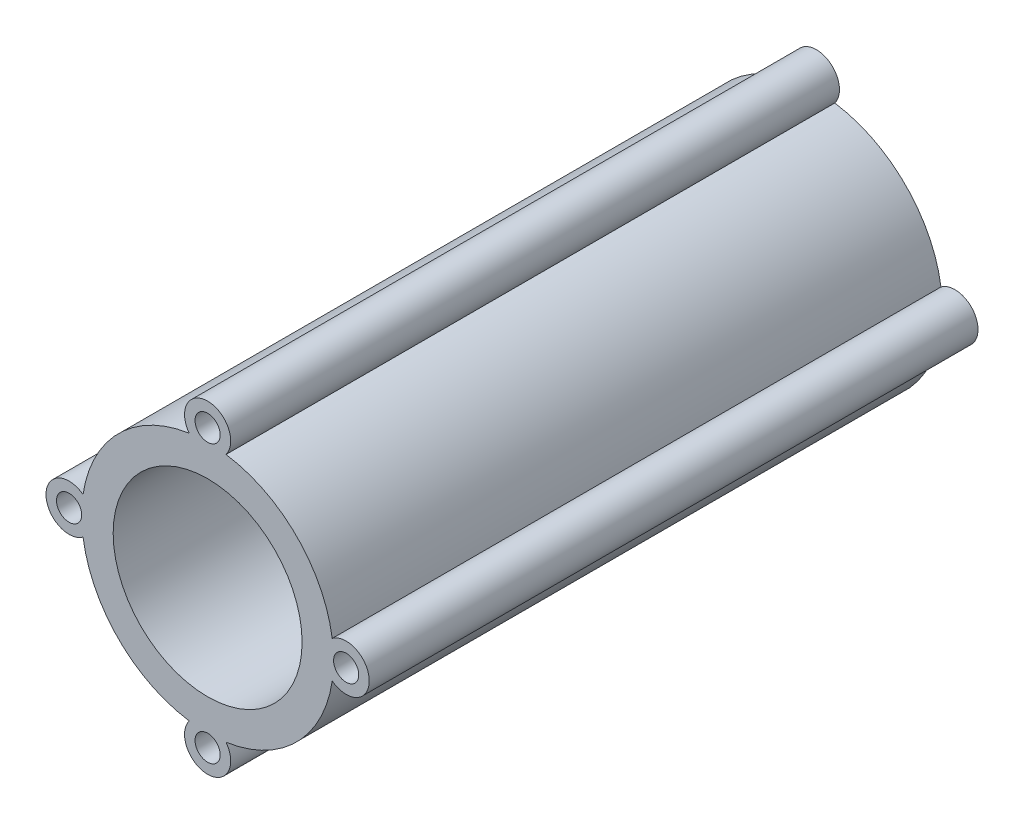
ISO-10303-21;
HEADER;
FILE_DESCRIPTION(('STEP AP214'),'2;1');
FILE_NAME('part.step','',(''),(''),'','','');
FILE_SCHEMA(('AUTOMOTIVE_DESIGN { 1 0 10303 214 1 1 1 1 }'));
ENDSEC;
DATA;
#1=APPLICATION_CONTEXT('core data for automotive mechanical design processes');
#2=APPLICATION_PROTOCOL_DEFINITION('international standard','automotive_design',2000,#1);
#3=PRODUCT_CONTEXT('',#1,'mechanical');
#4=PRODUCT('Part','Part','',(#3));
#5=PRODUCT_RELATED_PRODUCT_CATEGORY('part','',(#4));
#6=PRODUCT_DEFINITION_FORMATION('','',#4);
#7=PRODUCT_DEFINITION_CONTEXT('part definition',#1,'design');
#8=PRODUCT_DEFINITION('design','',#6,#7);
#9=PRODUCT_DEFINITION_SHAPE('','',#8);
#10=(LENGTH_UNIT() NAMED_UNIT(*) SI_UNIT(.MILLI.,.METRE.));
#11=(NAMED_UNIT(*) PLANE_ANGLE_UNIT() SI_UNIT($,.RADIAN.));
#12=(NAMED_UNIT(*) SI_UNIT($,.STERADIAN.) SOLID_ANGLE_UNIT());
#13=UNCERTAINTY_MEASURE_WITH_UNIT(LENGTH_MEASURE(1.E-05),#10,'distance_accuracy_value','');
#14=(GEOMETRIC_REPRESENTATION_CONTEXT(3) GLOBAL_UNCERTAINTY_ASSIGNED_CONTEXT((#13)) GLOBAL_UNIT_ASSIGNED_CONTEXT((#10,
#11,#12)) REPRESENTATION_CONTEXT('',''));
#15=CARTESIAN_POINT('',(0.,0.,0.));
#16=DIRECTION('',(0.,0.,1.));
#17=DIRECTION('',(1.,0.,0.));
#18=AXIS2_PLACEMENT_3D('',#15,#16,#17);
#19=CARTESIAN_POINT('',(0.,0.,145.));
#20=DIRECTION('',(0.,0.,-1.));
#21=DIRECTION('',(-1.,0.,0.));
#22=AXIS2_PLACEMENT_3D('',#19,#20,#21);
#23=CYLINDRICAL_SURFACE('',#22,30.);
#24=DIRECTION('',(0.,0.,-1.));
#25=VECTOR('',#24,1.);
#26=CARTESIAN_POINT('',(-4.38343670336576,-29.6780303030303,72.5));
#27=LINE('',#26,#25);
#28=CARTESIAN_POINT('',(-4.38343670336576,-29.6780303030303,145.));
#29=VERTEX_POINT('',#28);
#30=CARTESIAN_POINT('',(-4.38343670336576,-29.6780303030303,0.));
#31=VERTEX_POINT('',#30);
#32=EDGE_CURVE('E192',#29,#31,#27,.T.);
#33=ORIENTED_EDGE('',*,*,#32,.F.);
#34=CARTESIAN_POINT('',(0.,0.,145.));
#35=DIRECTION('',(0.,0.,1.));
#36=DIRECTION('',(1.,0.,0.));
#37=AXIS2_PLACEMENT_3D('',#34,#35,#36);
#38=CIRCLE('',#37,30.);
#39=CARTESIAN_POINT('',(-29.6780303030303,-4.38343670336587,145.));
#40=VERTEX_POINT('',#39);
#41=EDGE_CURVE('E12',#40,#29,#38,.T.);
#42=ORIENTED_EDGE('',*,*,#41,.F.);
#43=DIRECTION('',(0.,0.,-1.));
#44=VECTOR('',#43,1.);
#45=CARTESIAN_POINT('',(-29.6780303030303,-4.38343670336587,72.5));
#46=LINE('',#45,#44);
#47=CARTESIAN_POINT('',(-29.6780303030303,-4.38343670336587,0.));
#48=VERTEX_POINT('',#47);
#49=EDGE_CURVE('E208',#48,#40,#46,.F.);
#50=ORIENTED_EDGE('',*,*,#49,.F.);
#51=CARTESIAN_POINT('',(0.,0.,0.));
#52=DIRECTION('',(0.,0.,1.));
#53=DIRECTION('',(1.,0.,0.));
#54=AXIS2_PLACEMENT_3D('',#51,#52,#53);
#55=CIRCLE('',#54,30.);
#56=EDGE_CURVE('E75',#48,#31,#55,.T.);
#57=ORIENTED_EDGE('',*,*,#56,.T.);
#58=EDGE_LOOP('',(#33,#42,#50,#57));
#59=FACE_BOUND('',#58,.T.);
#60=ADVANCED_FACE('F71',(#59),#23,.T.);
#61=DIRECTION('',(0.,0.,-1.));
#62=VECTOR('',#61,1.);
#63=CARTESIAN_POINT('',(4.38343670336597,-29.6780303030303,72.5));
#64=LINE('',#63,#62);
#65=CARTESIAN_POINT('',(4.38343670336597,-29.6780303030303,0.));
#66=VERTEX_POINT('',#65);
#67=CARTESIAN_POINT('',(4.38343670336597,-29.6780303030303,145.));
#68=VERTEX_POINT('',#67);
#69=EDGE_CURVE('E188',#66,#68,#64,.F.);
#70=ORIENTED_EDGE('',*,*,#69,.F.);
#71=CARTESIAN_POINT('',(29.6780303030303,-4.38343670336587,0.));
#72=VERTEX_POINT('',#71);
#73=EDGE_CURVE('E230',#66,#72,#55,.T.);
#74=ORIENTED_EDGE('',*,*,#73,.T.);
#75=DIRECTION('',(0.,0.,-1.));
#76=VECTOR('',#75,1.);
#77=CARTESIAN_POINT('',(29.6780303030303,-4.38343670336587,72.5));
#78=LINE('',#77,#76);
#79=CARTESIAN_POINT('',(29.6780303030303,-4.38343670336587,145.));
#80=VERTEX_POINT('',#79);
#81=EDGE_CURVE('E98',#80,#72,#78,.T.);
#82=ORIENTED_EDGE('',*,*,#81,.F.);
#83=EDGE_CURVE('E81',#68,#80,#38,.T.);
#84=ORIENTED_EDGE('',*,*,#83,.F.);
#85=EDGE_LOOP('',(#70,#74,#82,#84));
#86=FACE_BOUND('',#85,.T.);
#87=ADVANCED_FACE('F238',(#86),#23,.T.);
#88=DIRECTION('',(0.,0.,-1.));
#89=VECTOR('',#88,1.);
#90=CARTESIAN_POINT('',(29.6780303030303,4.38343670336587,72.5));
#91=LINE('',#90,#89);
#92=CARTESIAN_POINT('',(29.6780303030303,4.38343670336587,0.));
#93=VERTEX_POINT('',#92);
#94=CARTESIAN_POINT('',(29.6780303030303,4.38343670336587,145.));
#95=VERTEX_POINT('',#94);
#96=EDGE_CURVE('E182',#93,#95,#91,.F.);
#97=ORIENTED_EDGE('',*,*,#96,.F.);
#98=CARTESIAN_POINT('',(4.38343670336555,29.6780303030303,0.));
#99=VERTEX_POINT('',#98);
#100=EDGE_CURVE('E227',#93,#99,#55,.T.);
#101=ORIENTED_EDGE('',*,*,#100,.T.);
#102=DIRECTION('',(0.,0.,-1.));
#103=VECTOR('',#102,1.);
#104=CARTESIAN_POINT('',(4.38343670336555,29.6780303030303,72.5));
#105=LINE('',#104,#103);
#106=CARTESIAN_POINT('',(4.38343670336555,29.6780303030303,145.));
#107=VERTEX_POINT('',#106);
#108=EDGE_CURVE('E90',#107,#99,#105,.T.);
#109=ORIENTED_EDGE('',*,*,#108,.F.);
#110=EDGE_CURVE('E150',#95,#107,#38,.T.);
#111=ORIENTED_EDGE('',*,*,#110,.F.);
#112=EDGE_LOOP('',(#97,#101,#109,#111));
#113=FACE_BOUND('',#112,.T.);
#114=ADVANCED_FACE('F288',(#113),#23,.T.);
#115=DIRECTION('',(0.,0.,-1.));
#116=VECTOR('',#115,1.);
#117=CARTESIAN_POINT('',(-4.38343670336618,29.6780303030303,72.5));
#118=LINE('',#117,#116);
#119=CARTESIAN_POINT('',(-4.38343670336618,29.6780303030303,0.));
#120=VERTEX_POINT('',#119);
#121=CARTESIAN_POINT('',(-4.38343670336618,29.6780303030303,145.));
#122=VERTEX_POINT('',#121);
#123=EDGE_CURVE('E141',#120,#122,#118,.F.);
#124=ORIENTED_EDGE('',*,*,#123,.F.);
#125=CARTESIAN_POINT('',(-29.6780303030303,4.38343670336587,0.));
#126=VERTEX_POINT('',#125);
#127=EDGE_CURVE('E222',#120,#126,#55,.T.);
#128=ORIENTED_EDGE('',*,*,#127,.T.);
#129=DIRECTION('',(0.,0.,-1.));
#130=VECTOR('',#129,1.);
#131=CARTESIAN_POINT('',(-29.6780303030303,4.38343670336587,72.5));
#132=LINE('',#131,#130);
#133=CARTESIAN_POINT('',(-29.6780303030303,4.38343670336587,145.));
#134=VERTEX_POINT('',#133);
#135=EDGE_CURVE('E144',#134,#126,#132,.T.);
#136=ORIENTED_EDGE('',*,*,#135,.F.);
#137=EDGE_CURVE('E83',#122,#134,#38,.T.);
#138=ORIENTED_EDGE('',*,*,#137,.F.);
#139=EDGE_LOOP('',(#124,#128,#136,#138));
#140=FACE_BOUND('',#139,.T.);
#141=ADVANCED_FACE('F140',(#140),#23,.T.);
#142=CARTESIAN_POINT('',(0.,0.,145.));
#143=DIRECTION('',(0.,0.,-1.));
#144=DIRECTION('',(-1.,0.,0.));
#145=AXIS2_PLACEMENT_3D('',#142,#143,#144);
#146=CYLINDRICAL_SURFACE('',#145,22.5);
#147=CARTESIAN_POINT('',(0.,0.,145.));
#148=DIRECTION('',(0.,0.,1.));
#149=DIRECTION('',(1.,0.,0.));
#150=AXIS2_PLACEMENT_3D('',#147,#148,#149);
#151=CIRCLE('',#150,22.5);
#152=CARTESIAN_POINT('',(22.5,0.,145.));
#153=VERTEX_POINT('',#152);
#154=EDGE_CURVE('E151',#153,#153,#151,.T.);
#155=ORIENTED_EDGE('',*,*,#154,.T.);
#156=EDGE_LOOP('',(#155));
#157=FACE_BOUND('',#156,.T.);
#158=CARTESIAN_POINT('',(0.,0.,0.));
#159=DIRECTION('',(0.,0.,1.));
#160=DIRECTION('',(1.,0.,0.));
#161=AXIS2_PLACEMENT_3D('',#158,#159,#160);
#162=CIRCLE('',#161,22.5);
#163=CARTESIAN_POINT('',(22.5,0.,0.));
#164=VERTEX_POINT('',#163);
#165=EDGE_CURVE('E217',#164,#164,#162,.T.);
#166=ORIENTED_EDGE('',*,*,#165,.F.);
#167=EDGE_LOOP('',(#166));
#168=FACE_BOUND('',#167,.T.);
#169=ADVANCED_FACE('F73',(#157,#168),#146,.F.);
#170=CARTESIAN_POINT('',(0.,0.,145.));
#171=DIRECTION('',(0.,0.,1.));
#172=DIRECTION('',(1.,0.,0.));
#173=AXIS2_PLACEMENT_3D('',#170,#171,#172);
#174=PLANE('',#173);
#175=CARTESIAN_POINT('',(1.15218884181823E-13,-33.,145.));
#176=DIRECTION('',(0.,0.,1.));
#177=DIRECTION('',(0.,1.,0.));
#178=AXIS2_PLACEMENT_3D('',#175,#176,#177);
#179=CIRCLE('',#178,3.);
#180=CARTESIAN_POINT('',(1.04744440165294E-13,-30.,145.));
#181=VERTEX_POINT('',#180);
#182=EDGE_CURVE('E312',#181,#181,#179,.T.);
#183=ORIENTED_EDGE('',*,*,#182,.F.);
#184=EDGE_LOOP('',(#183));
#185=FACE_BOUND('',#184,.T.);
#186=CARTESIAN_POINT('',(33.,0.,145.));
#187=DIRECTION('',(0.,0.,1.));
#188=DIRECTION('',(-1.,0.,0.));
#189=AXIS2_PLACEMENT_3D('',#186,#187,#188);
#190=CIRCLE('',#189,5.5);
#191=EDGE_CURVE('E248',#80,#95,#190,.T.);
#192=ORIENTED_EDGE('',*,*,#191,.T.);
#193=ORIENTED_EDGE('',*,*,#110,.T.);
#194=CARTESIAN_POINT('',(-3.4565665254547E-13,33.,145.));
#195=DIRECTION('',(0.,0.,1.));
#196=DIRECTION('',(0.,-1.,0.));
#197=AXIS2_PLACEMENT_3D('',#194,#195,#196);
#198=CIRCLE('',#197,5.5);
#199=EDGE_CURVE('E156',#107,#122,#198,.T.);
#200=ORIENTED_EDGE('',*,*,#199,.T.);
#201=ORIENTED_EDGE('',*,*,#137,.T.);
#202=CARTESIAN_POINT('',(-33.,0.,145.));
#203=DIRECTION('',(0.,0.,1.));
#204=DIRECTION('',(1.,0.,0.));
#205=AXIS2_PLACEMENT_3D('',#202,#203,#204);
#206=CIRCLE('',#205,5.5);
#207=EDGE_CURVE('E205',#134,#40,#206,.T.);
#208=ORIENTED_EDGE('',*,*,#207,.T.);
#209=ORIENTED_EDGE('',*,*,#41,.T.);
#210=CARTESIAN_POINT('',(1.15218884181823E-13,-33.,145.));
#211=DIRECTION('',(0.,0.,1.));
#212=DIRECTION('',(0.,1.,0.));
#213=AXIS2_PLACEMENT_3D('',#210,#211,#212);
#214=CIRCLE('',#213,5.5);
#215=EDGE_CURVE('E160',#29,#68,#214,.T.);
#216=ORIENTED_EDGE('',*,*,#215,.T.);
#217=ORIENTED_EDGE('',*,*,#83,.T.);
#218=EDGE_LOOP('',(#192,#193,#200,#201,#208,#209,#216,#217));
#219=FACE_BOUND('',#218,.T.);
#220=CARTESIAN_POINT('',(-3.4565665254547E-13,33.,145.));
#221=DIRECTION('',(0.,0.,1.));
#222=DIRECTION('',(0.,-1.,0.));
#223=AXIS2_PLACEMENT_3D('',#220,#221,#222);
#224=CIRCLE('',#223,3.);
#225=CARTESIAN_POINT('',(-3.14233320495882E-13,30.,145.));
#226=VERTEX_POINT('',#225);
#227=EDGE_CURVE('E174',#226,#226,#224,.T.);
#228=ORIENTED_EDGE('',*,*,#227,.F.);
#229=EDGE_LOOP('',(#228));
#230=FACE_BOUND('',#229,.T.);
#231=CARTESIAN_POINT('',(-33.,0.,145.));
#232=DIRECTION('',(0.,0.,1.));
#233=DIRECTION('',(1.,0.,0.));
#234=AXIS2_PLACEMENT_3D('',#231,#232,#233);
#235=CIRCLE('',#234,3.);
#236=CARTESIAN_POINT('',(-30.,0.,145.));
#237=VERTEX_POINT('',#236);
#238=EDGE_CURVE('E197',#237,#237,#235,.T.);
#239=ORIENTED_EDGE('',*,*,#238,.F.);
#240=EDGE_LOOP('',(#239));
#241=FACE_BOUND('',#240,.T.);
#242=ORIENTED_EDGE('',*,*,#154,.F.);
#243=EDGE_LOOP('',(#242));
#244=FACE_BOUND('',#243,.T.);
#245=CARTESIAN_POINT('',(33.,0.,145.));
#246=DIRECTION('',(0.,0.,1.));
#247=DIRECTION('',(-1.,0.,0.));
#248=AXIS2_PLACEMENT_3D('',#245,#246,#247);
#249=CIRCLE('',#248,3.);
#250=CARTESIAN_POINT('',(30.,0.,145.));
#251=VERTEX_POINT('',#250);
#252=EDGE_CURVE('E172',#251,#251,#249,.T.);
#253=ORIENTED_EDGE('',*,*,#252,.F.);
#254=EDGE_LOOP('',(#253));
#255=FACE_BOUND('',#254,.T.);
#256=ADVANCED_FACE('F163',(#185,#219,#230,#241,#244,#255),#174,.T.);
#257=CARTESIAN_POINT('',(0.,0.,0.));
#258=DIRECTION('',(0.,0.,1.));
#259=DIRECTION('',(1.,0.,0.));
#260=AXIS2_PLACEMENT_3D('',#257,#258,#259);
#261=PLANE('',#260);
#262=CARTESIAN_POINT('',(1.15218884181823E-13,-33.,0.));
#263=DIRECTION('',(0.,0.,1.));
#264=DIRECTION('',(0.,1.,0.));
#265=AXIS2_PLACEMENT_3D('',#262,#263,#264);
#266=CIRCLE('',#265,3.);
#267=CARTESIAN_POINT('',(1.04744440165294E-13,-30.,0.));
#268=VERTEX_POINT('',#267);
#269=EDGE_CURVE('E257',#268,#268,#266,.T.);
#270=ORIENTED_EDGE('',*,*,#269,.T.);
#271=EDGE_LOOP('',(#270));
#272=FACE_BOUND('',#271,.T.);
#273=ORIENTED_EDGE('',*,*,#100,.F.);
#274=CARTESIAN_POINT('',(33.,0.,0.));
#275=DIRECTION('',(0.,0.,1.));
#276=DIRECTION('',(-1.,0.,0.));
#277=AXIS2_PLACEMENT_3D('',#274,#275,#276);
#278=CIRCLE('',#277,5.5);
#279=EDGE_CURVE('E247',#72,#93,#278,.T.);
#280=ORIENTED_EDGE('',*,*,#279,.F.);
#281=ORIENTED_EDGE('',*,*,#73,.F.);
#282=CARTESIAN_POINT('',(1.15218884181823E-13,-33.,0.));
#283=DIRECTION('',(0.,0.,1.));
#284=DIRECTION('',(0.,1.,0.));
#285=AXIS2_PLACEMENT_3D('',#282,#283,#284);
#286=CIRCLE('',#285,5.5);
#287=EDGE_CURVE('E310',#31,#66,#286,.T.);
#288=ORIENTED_EDGE('',*,*,#287,.F.);
#289=ORIENTED_EDGE('',*,*,#56,.F.);
#290=CARTESIAN_POINT('',(-33.,0.,0.));
#291=DIRECTION('',(0.,0.,1.));
#292=DIRECTION('',(1.,0.,0.));
#293=AXIS2_PLACEMENT_3D('',#290,#291,#292);
#294=CIRCLE('',#293,5.5);
#295=EDGE_CURVE('E201',#126,#48,#294,.T.);
#296=ORIENTED_EDGE('',*,*,#295,.F.);
#297=ORIENTED_EDGE('',*,*,#127,.F.);
#298=CARTESIAN_POINT('',(-3.4565665254547E-13,33.,0.));
#299=DIRECTION('',(0.,0.,1.));
#300=DIRECTION('',(0.,-1.,0.));
#301=AXIS2_PLACEMENT_3D('',#298,#299,#300);
#302=CIRCLE('',#301,5.5);
#303=EDGE_CURVE('E158',#99,#120,#302,.T.);
#304=ORIENTED_EDGE('',*,*,#303,.F.);
#305=EDGE_LOOP('',(#273,#280,#281,#288,#289,#296,#297,#304));
#306=FACE_BOUND('',#305,.T.);
#307=CARTESIAN_POINT('',(-3.4565665254547E-13,33.,0.));
#308=DIRECTION('',(0.,0.,1.));
#309=DIRECTION('',(0.,-1.,0.));
#310=AXIS2_PLACEMENT_3D('',#307,#308,#309);
#311=CIRCLE('',#310,3.);
#312=CARTESIAN_POINT('',(-3.14233320495882E-13,30.,0.));
#313=VERTEX_POINT('',#312);
#314=EDGE_CURVE('E177',#313,#313,#311,.T.);
#315=ORIENTED_EDGE('',*,*,#314,.T.);
#316=EDGE_LOOP('',(#315));
#317=FACE_BOUND('',#316,.T.);
#318=CARTESIAN_POINT('',(33.,0.,0.));
#319=DIRECTION('',(0.,0.,1.));
#320=DIRECTION('',(-1.,0.,0.));
#321=AXIS2_PLACEMENT_3D('',#318,#319,#320);
#322=CIRCLE('',#321,3.);
#323=CARTESIAN_POINT('',(30.,0.,0.));
#324=VERTEX_POINT('',#323);
#325=EDGE_CURVE('E166',#324,#324,#322,.T.);
#326=ORIENTED_EDGE('',*,*,#325,.T.);
#327=EDGE_LOOP('',(#326));
#328=FACE_BOUND('',#327,.T.);
#329=CARTESIAN_POINT('',(-33.,0.,0.));
#330=DIRECTION('',(0.,0.,1.));
#331=DIRECTION('',(1.,0.,0.));
#332=AXIS2_PLACEMENT_3D('',#329,#330,#331);
#333=CIRCLE('',#332,3.);
#334=CARTESIAN_POINT('',(-30.,0.,0.));
#335=VERTEX_POINT('',#334);
#336=EDGE_CURVE('E196',#335,#335,#333,.T.);
#337=ORIENTED_EDGE('',*,*,#336,.T.);
#338=EDGE_LOOP('',(#337));
#339=FACE_BOUND('',#338,.T.);
#340=ORIENTED_EDGE('',*,*,#165,.T.);
#341=EDGE_LOOP('',(#340));
#342=FACE_BOUND('',#341,.T.);
#343=ADVANCED_FACE('F250',(#272,#306,#317,#328,#339,#342),#261,.F.);
#344=CARTESIAN_POINT('',(-33.,0.,145.));
#345=DIRECTION('',(0.,0.,-1.));
#346=DIRECTION('',(-1.,0.,0.));
#347=AXIS2_PLACEMENT_3D('',#344,#345,#346);
#348=CYLINDRICAL_SURFACE('',#347,5.5);
#349=ORIENTED_EDGE('',*,*,#207,.F.);
#350=ORIENTED_EDGE('',*,*,#135,.T.);
#351=ORIENTED_EDGE('',*,*,#295,.T.);
#352=ORIENTED_EDGE('',*,*,#49,.T.);
#353=EDGE_LOOP('',(#349,#350,#351,#352));
#354=FACE_BOUND('',#353,.T.);
#355=ADVANCED_FACE('F337',(#354),#348,.T.);
#356=CARTESIAN_POINT('',(-33.,0.,145.));
#357=DIRECTION('',(0.,0.,-1.));
#358=DIRECTION('',(-1.,0.,0.));
#359=AXIS2_PLACEMENT_3D('',#356,#357,#358);
#360=CYLINDRICAL_SURFACE('',#359,3.);
#361=ORIENTED_EDGE('',*,*,#336,.F.);
#362=EDGE_LOOP('',(#361));
#363=FACE_BOUND('',#362,.T.);
#364=ORIENTED_EDGE('',*,*,#238,.T.);
#365=EDGE_LOOP('',(#364));
#366=FACE_BOUND('',#365,.T.);
#367=ADVANCED_FACE('F281',(#363,#366),#360,.F.);
#368=CARTESIAN_POINT('',(-3.4565665254547E-13,33.,145.));
#369=DIRECTION('',(0.,0.,-1.));
#370=DIRECTION('',(-1.,0.,0.));
#371=AXIS2_PLACEMENT_3D('',#368,#369,#370);
#372=CYLINDRICAL_SURFACE('',#371,5.5);
#373=ORIENTED_EDGE('',*,*,#199,.F.);
#374=ORIENTED_EDGE('',*,*,#108,.T.);
#375=ORIENTED_EDGE('',*,*,#303,.T.);
#376=ORIENTED_EDGE('',*,*,#123,.T.);
#377=EDGE_LOOP('',(#373,#374,#375,#376));
#378=FACE_BOUND('',#377,.T.);
#379=ADVANCED_FACE('F155',(#378),#372,.T.);
#380=CARTESIAN_POINT('',(-3.4565665254547E-13,33.,145.));
#381=DIRECTION('',(0.,0.,-1.));
#382=DIRECTION('',(-1.,0.,0.));
#383=AXIS2_PLACEMENT_3D('',#380,#381,#382);
#384=CYLINDRICAL_SURFACE('',#383,3.);
#385=ORIENTED_EDGE('',*,*,#314,.F.);
#386=EDGE_LOOP('',(#385));
#387=FACE_BOUND('',#386,.T.);
#388=ORIENTED_EDGE('',*,*,#227,.T.);
#389=EDGE_LOOP('',(#388));
#390=FACE_BOUND('',#389,.T.);
#391=ADVANCED_FACE('F272',(#387,#390),#384,.F.);
#392=CARTESIAN_POINT('',(33.,0.,145.));
#393=DIRECTION('',(0.,0.,-1.));
#394=DIRECTION('',(-1.,0.,0.));
#395=AXIS2_PLACEMENT_3D('',#392,#393,#394);
#396=CYLINDRICAL_SURFACE('',#395,5.5);
#397=ORIENTED_EDGE('',*,*,#191,.F.);
#398=ORIENTED_EDGE('',*,*,#81,.T.);
#399=ORIENTED_EDGE('',*,*,#279,.T.);
#400=ORIENTED_EDGE('',*,*,#96,.T.);
#401=EDGE_LOOP('',(#397,#398,#399,#400));
#402=FACE_BOUND('',#401,.T.);
#403=ADVANCED_FACE('F246',(#402),#396,.T.);
#404=CARTESIAN_POINT('',(33.,0.,145.));
#405=DIRECTION('',(0.,0.,-1.));
#406=DIRECTION('',(-1.,0.,0.));
#407=AXIS2_PLACEMENT_3D('',#404,#405,#406);
#408=CYLINDRICAL_SURFACE('',#407,3.);
#409=ORIENTED_EDGE('',*,*,#325,.F.);
#410=EDGE_LOOP('',(#409));
#411=FACE_BOUND('',#410,.T.);
#412=ORIENTED_EDGE('',*,*,#252,.T.);
#413=EDGE_LOOP('',(#412));
#414=FACE_BOUND('',#413,.T.);
#415=ADVANCED_FACE('F279',(#411,#414),#408,.F.);
#416=CARTESIAN_POINT('',(1.15218884181823E-13,-33.,145.));
#417=DIRECTION('',(0.,0.,-1.));
#418=DIRECTION('',(-1.,0.,0.));
#419=AXIS2_PLACEMENT_3D('',#416,#417,#418);
#420=CYLINDRICAL_SURFACE('',#419,5.5);
#421=ORIENTED_EDGE('',*,*,#215,.F.);
#422=ORIENTED_EDGE('',*,*,#32,.T.);
#423=ORIENTED_EDGE('',*,*,#287,.T.);
#424=ORIENTED_EDGE('',*,*,#69,.T.);
#425=EDGE_LOOP('',(#421,#422,#423,#424));
#426=FACE_BOUND('',#425,.T.);
#427=ADVANCED_FACE('F309',(#426),#420,.T.);
#428=CARTESIAN_POINT('',(1.15218884181823E-13,-33.,145.));
#429=DIRECTION('',(0.,0.,-1.));
#430=DIRECTION('',(-1.,0.,0.));
#431=AXIS2_PLACEMENT_3D('',#428,#429,#430);
#432=CYLINDRICAL_SURFACE('',#431,3.);
#433=ORIENTED_EDGE('',*,*,#269,.F.);
#434=EDGE_LOOP('',(#433));
#435=FACE_BOUND('',#434,.T.);
#436=ORIENTED_EDGE('',*,*,#182,.T.);
#437=EDGE_LOOP('',(#436));
#438=FACE_BOUND('',#437,.T.);
#439=ADVANCED_FACE('F327',(#435,#438),#432,.F.);
#440=CLOSED_SHELL('',(#60,#87,#114,#141,#169,#256,#343,#355,#367,#379,#391,#403,#415,#427,#439));
#441=MANIFOLD_SOLID_BREP('B2',#440);
#442=ADVANCED_BREP_SHAPE_REPRESENTATION('',(#18,#441),#14);
#443=SHAPE_DEFINITION_REPRESENTATION(#9,#442);
ENDSEC;
END-ISO-10303-21;
